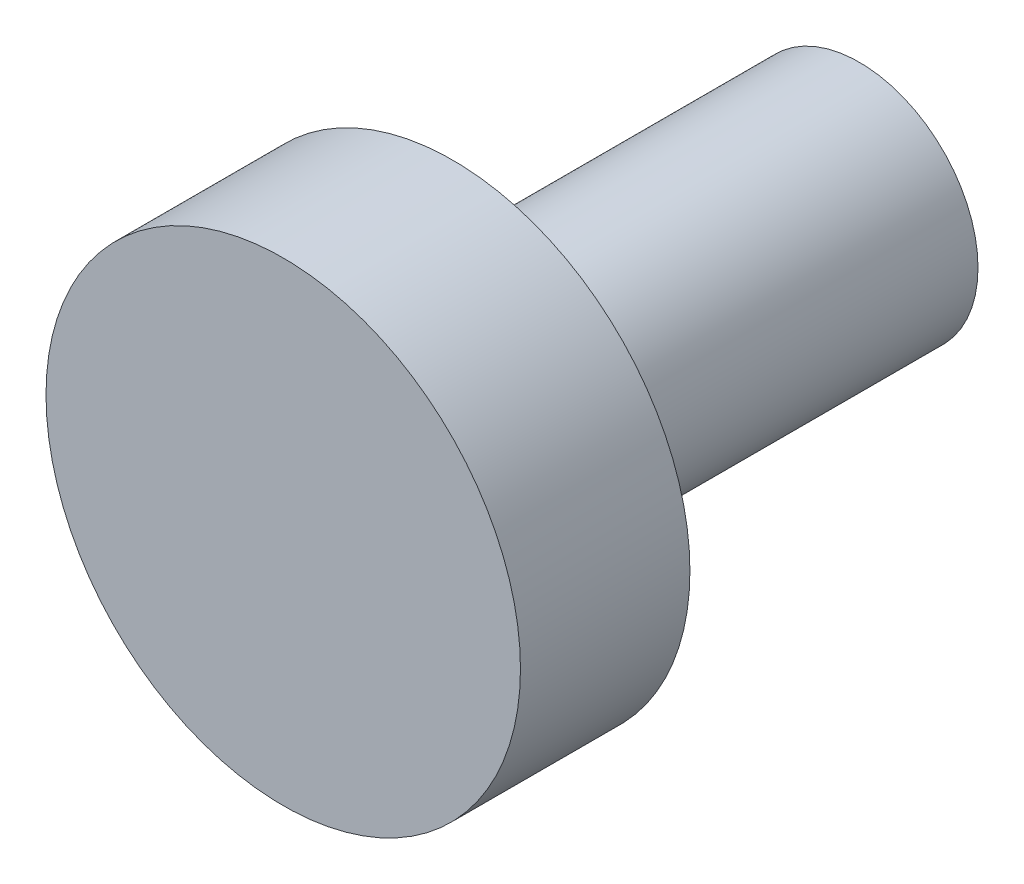
ISO-10303-21;
HEADER;
FILE_DESCRIPTION(('STEP AP214'),'2;1');
FILE_NAME('part.step','',(''),(''),'','','');
FILE_SCHEMA(('AUTOMOTIVE_DESIGN { 1 0 10303 214 1 1 1 1 }'));
ENDSEC;
DATA;
#1=APPLICATION_CONTEXT('core data for automotive mechanical design processes');
#2=APPLICATION_PROTOCOL_DEFINITION('international standard','automotive_design',2000,#1);
#3=PRODUCT_CONTEXT('',#1,'mechanical');
#4=PRODUCT('Part','Part','',(#3));
#5=PRODUCT_RELATED_PRODUCT_CATEGORY('part','',(#4));
#6=PRODUCT_DEFINITION_FORMATION('','',#4);
#7=PRODUCT_DEFINITION_CONTEXT('part definition',#1,'design');
#8=PRODUCT_DEFINITION('design','',#6,#7);
#9=PRODUCT_DEFINITION_SHAPE('','',#8);
#10=(LENGTH_UNIT() NAMED_UNIT(*) SI_UNIT(.MILLI.,.METRE.));
#11=(NAMED_UNIT(*) PLANE_ANGLE_UNIT() SI_UNIT($,.RADIAN.));
#12=(NAMED_UNIT(*) SI_UNIT($,.STERADIAN.) SOLID_ANGLE_UNIT());
#13=UNCERTAINTY_MEASURE_WITH_UNIT(LENGTH_MEASURE(1.E-05),#10,'distance_accuracy_value','');
#14=(GEOMETRIC_REPRESENTATION_CONTEXT(3) GLOBAL_UNCERTAINTY_ASSIGNED_CONTEXT((#13)) GLOBAL_UNIT_ASSIGNED_CONTEXT((#10,
#11,#12)) REPRESENTATION_CONTEXT('',''));
#15=CARTESIAN_POINT('',(0.,0.,0.));
#16=DIRECTION('',(0.,0.,1.));
#17=DIRECTION('',(1.,0.,0.));
#18=AXIS2_PLACEMENT_3D('',#15,#16,#17);
#19=CARTESIAN_POINT('',(0.,0.,6.));
#20=DIRECTION('',(0.,0.,-1.));
#21=DIRECTION('',(-1.,0.,0.));
#22=AXIS2_PLACEMENT_3D('',#19,#20,#21);
#23=CYLINDRICAL_SURFACE('',#22,1.75);
#24=CARTESIAN_POINT('',(0.,0.,6.));
#25=DIRECTION('',(0.,0.,1.));
#26=DIRECTION('',(1.,0.,0.));
#27=AXIS2_PLACEMENT_3D('',#24,#25,#26);
#28=CIRCLE('',#27,1.75);
#29=CARTESIAN_POINT('',(1.75,0.,6.));
#30=VERTEX_POINT('',#29);
#31=EDGE_CURVE('E10',#30,#30,#28,.T.);
#32=ORIENTED_EDGE('',*,*,#31,.F.);
#33=EDGE_LOOP('',(#32));
#34=FACE_BOUND('',#33,.T.);
#35=CARTESIAN_POINT('',(0.,0.,0.));
#36=DIRECTION('',(0.,0.,1.));
#37=DIRECTION('',(1.,0.,0.));
#38=AXIS2_PLACEMENT_3D('',#35,#36,#37);
#39=CIRCLE('',#38,1.75);
#40=CARTESIAN_POINT('',(1.75,0.,0.));
#41=VERTEX_POINT('',#40);
#42=EDGE_CURVE('E40',#41,#41,#39,.T.);
#43=ORIENTED_EDGE('',*,*,#42,.T.);
#44=EDGE_LOOP('',(#43));
#45=FACE_BOUND('',#44,.T.);
#46=ADVANCED_FACE('F37',(#34,#45),#23,.T.);
#47=CARTESIAN_POINT('',(0.,0.,0.));
#48=DIRECTION('',(0.,0.,1.));
#49=DIRECTION('',(1.,0.,0.));
#50=AXIS2_PLACEMENT_3D('',#47,#48,#49);
#51=PLANE('',#50);
#52=ORIENTED_EDGE('',*,*,#42,.F.);
#53=EDGE_LOOP('',(#52));
#54=FACE_BOUND('',#53,.T.);
#55=ADVANCED_FACE('F64',(#54),#51,.F.);
#56=CARTESIAN_POINT('',(0.,0.,8.5));
#57=DIRECTION('',(0.,0.,-1.));
#58=DIRECTION('',(-1.,0.,0.));
#59=AXIS2_PLACEMENT_3D('',#56,#57,#58);
#60=CYLINDRICAL_SURFACE('',#59,3.5);
#61=CARTESIAN_POINT('',(0.,0.,8.5));
#62=DIRECTION('',(0.,0.,1.));
#63=DIRECTION('',(1.,0.,0.));
#64=AXIS2_PLACEMENT_3D('',#61,#62,#63);
#65=CIRCLE('',#64,3.5);
#66=CARTESIAN_POINT('',(3.5,0.,8.5));
#67=VERTEX_POINT('',#66);
#68=EDGE_CURVE('E49',#67,#67,#65,.T.);
#69=ORIENTED_EDGE('',*,*,#68,.F.);
#70=EDGE_LOOP('',(#69));
#71=FACE_BOUND('',#70,.T.);
#72=CARTESIAN_POINT('',(0.,0.,6.));
#73=DIRECTION('',(0.,0.,1.));
#74=DIRECTION('',(1.,0.,0.));
#75=AXIS2_PLACEMENT_3D('',#72,#73,#74);
#76=CIRCLE('',#75,3.5);
#77=CARTESIAN_POINT('',(3.5,0.,6.));
#78=VERTEX_POINT('',#77);
#79=EDGE_CURVE('E51',#78,#78,#76,.T.);
#80=ORIENTED_EDGE('',*,*,#79,.T.);
#81=EDGE_LOOP('',(#80));
#82=FACE_BOUND('',#81,.T.);
#83=ADVANCED_FACE('F61',(#71,#82),#60,.T.);
#84=CARTESIAN_POINT('',(0.,0.,8.5));
#85=DIRECTION('',(0.,0.,1.));
#86=DIRECTION('',(1.,0.,0.));
#87=AXIS2_PLACEMENT_3D('',#84,#85,#86);
#88=PLANE('',#87);
#89=ORIENTED_EDGE('',*,*,#68,.T.);
#90=EDGE_LOOP('',(#89));
#91=FACE_BOUND('',#90,.T.);
#92=ADVANCED_FACE('F59',(#91),#88,.T.);
#93=CARTESIAN_POINT('',(0.,0.,6.));
#94=DIRECTION('',(0.,0.,1.));
#95=DIRECTION('',(1.,0.,0.));
#96=AXIS2_PLACEMENT_3D('',#93,#94,#95);
#97=PLANE('',#96);
#98=ORIENTED_EDGE('',*,*,#31,.T.);
#99=EDGE_LOOP('',(#98));
#100=FACE_BOUND('',#99,.T.);
#101=ORIENTED_EDGE('',*,*,#79,.F.);
#102=EDGE_LOOP('',(#101));
#103=FACE_BOUND('',#102,.T.);
#104=ADVANCED_FACE('F68',(#100,#103),#97,.F.);
#105=CLOSED_SHELL('',(#46,#55,#83,#92,#104));
#106=MANIFOLD_SOLID_BREP('B2',#105);
#107=ADVANCED_BREP_SHAPE_REPRESENTATION('',(#18,#106),#14);
#108=SHAPE_DEFINITION_REPRESENTATION(#9,#107);
ENDSEC;
END-ISO-10303-21;
